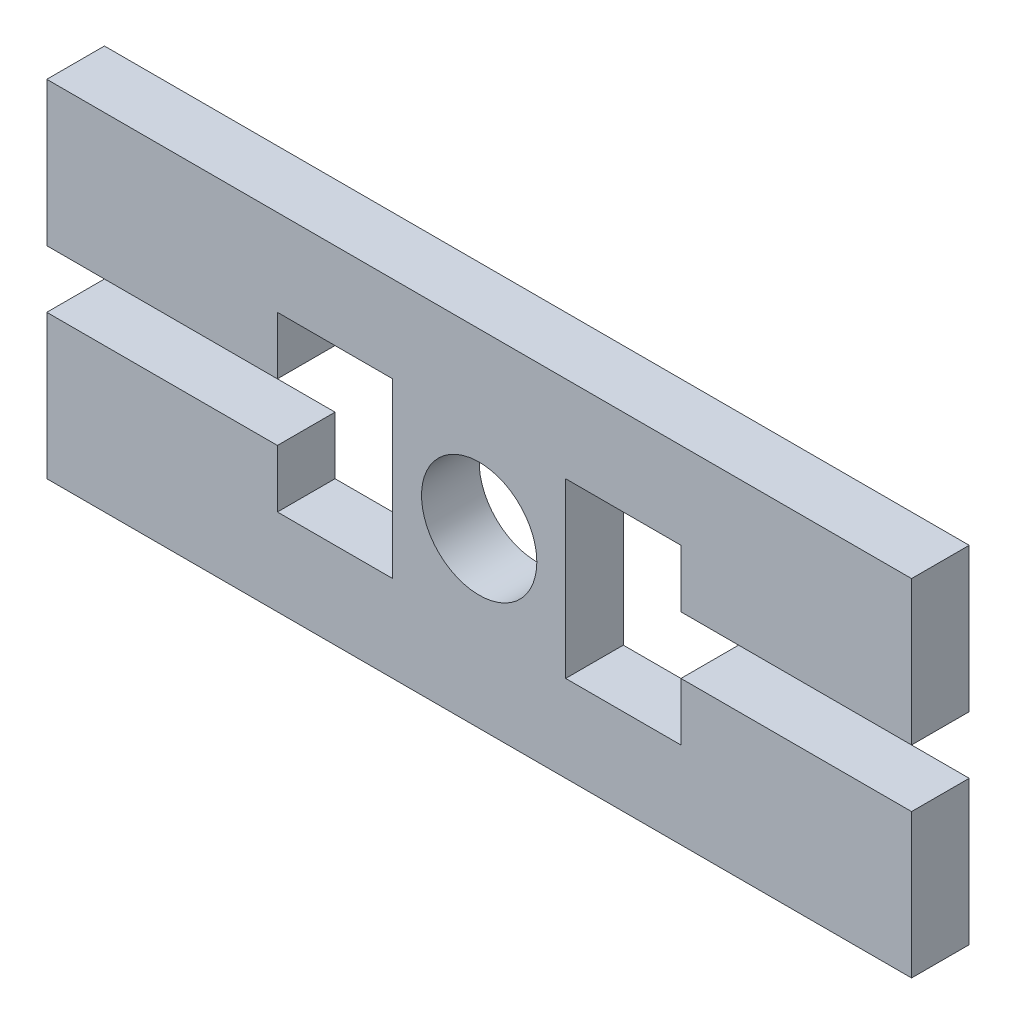
ISO-10303-21;
HEADER;
FILE_DESCRIPTION(('STEP AP214'),'2;1');
FILE_NAME('part.step','',(''),(''),'','','');
FILE_SCHEMA(('AUTOMOTIVE_DESIGN { 1 0 10303 214 1 1 1 1 }'));
ENDSEC;
DATA;
#1=APPLICATION_CONTEXT('core data for automotive mechanical design processes');
#2=APPLICATION_PROTOCOL_DEFINITION('international standard','automotive_design',2000,#1);
#3=PRODUCT_CONTEXT('',#1,'mechanical');
#4=PRODUCT('Part','Part','',(#3));
#5=PRODUCT_RELATED_PRODUCT_CATEGORY('part','',(#4));
#6=PRODUCT_DEFINITION_FORMATION('','',#4);
#7=PRODUCT_DEFINITION_CONTEXT('part definition',#1,'design');
#8=PRODUCT_DEFINITION('design','',#6,#7);
#9=PRODUCT_DEFINITION_SHAPE('','',#8);
#10=(LENGTH_UNIT() NAMED_UNIT(*) SI_UNIT(.MILLI.,.METRE.));
#11=(NAMED_UNIT(*) PLANE_ANGLE_UNIT() SI_UNIT($,.RADIAN.));
#12=(NAMED_UNIT(*) SI_UNIT($,.STERADIAN.) SOLID_ANGLE_UNIT());
#13=UNCERTAINTY_MEASURE_WITH_UNIT(LENGTH_MEASURE(1.E-05),#10,'distance_accuracy_value','');
#14=(GEOMETRIC_REPRESENTATION_CONTEXT(3) GLOBAL_UNCERTAINTY_ASSIGNED_CONTEXT((#13)) GLOBAL_UNIT_ASSIGNED_CONTEXT((#10,
#11,#12)) REPRESENTATION_CONTEXT('',''));
#15=CARTESIAN_POINT('',(0.,0.,0.));
#16=DIRECTION('',(0.,0.,1.));
#17=DIRECTION('',(1.,0.,0.));
#18=AXIS2_PLACEMENT_3D('',#15,#16,#17);
#19=CARTESIAN_POINT('',(0.,0.,12.7));
#20=DIRECTION('',(0.,0.,1.));
#21=DIRECTION('',(1.,0.,0.));
#22=AXIS2_PLACEMENT_3D('',#19,#20,#21);
#23=PLANE('',#22);
#24=DIRECTION('',(0.,1.,0.));
#25=VECTOR('',#24,1.);
#26=CARTESIAN_POINT('',(95.25,-6.35000000000004,12.7));
#27=LINE('',#26,#25);
#28=CARTESIAN_POINT('',(95.25,-38.1,12.7));
#29=VERTEX_POINT('',#28);
#30=CARTESIAN_POINT('',(95.25,-6.35000000000004,12.7));
#31=VERTEX_POINT('',#30);
#32=EDGE_CURVE('E272',#29,#31,#27,.T.);
#33=ORIENTED_EDGE('',*,*,#32,.T.);
#34=DIRECTION('',(-1.,0.,0.));
#35=VECTOR('',#34,1.);
#36=CARTESIAN_POINT('',(95.25,-6.35000000000004,12.7));
#37=LINE('',#36,#35);
#38=CARTESIAN_POINT('',(44.45,-6.35000000000004,12.7));
#39=VERTEX_POINT('',#38);
#40=EDGE_CURVE('E136',#31,#39,#37,.T.);
#41=ORIENTED_EDGE('',*,*,#40,.T.);
#42=DIRECTION('',(0.,-1.,0.));
#43=VECTOR('',#42,1.);
#44=CARTESIAN_POINT('',(44.45,-6.35000000000004,12.7));
#45=LINE('',#44,#43);
#46=CARTESIAN_POINT('',(44.45,-19.05,12.7));
#47=VERTEX_POINT('',#46);
#48=EDGE_CURVE('E341',#39,#47,#45,.T.);
#49=ORIENTED_EDGE('',*,*,#48,.T.);
#50=DIRECTION('',(-1.,0.,0.));
#51=VECTOR('',#50,1.);
#52=CARTESIAN_POINT('',(44.45,-19.05,12.7));
#53=LINE('',#52,#51);
#54=CARTESIAN_POINT('',(19.05,-19.05,12.7));
#55=VERTEX_POINT('',#54);
#56=EDGE_CURVE('E361',#47,#55,#53,.T.);
#57=ORIENTED_EDGE('',*,*,#56,.T.);
#58=DIRECTION('',(0.,1.,0.));
#59=VECTOR('',#58,1.);
#60=CARTESIAN_POINT('',(19.05,19.05,12.7));
#61=LINE('',#60,#59);
#62=CARTESIAN_POINT('',(19.05,19.05,12.7));
#63=VERTEX_POINT('',#62);
#64=EDGE_CURVE('E357',#55,#63,#61,.T.);
#65=ORIENTED_EDGE('',*,*,#64,.T.);
#66=DIRECTION('',(1.,0.,0.));
#67=VECTOR('',#66,1.);
#68=CARTESIAN_POINT('',(44.45,19.05,12.7));
#69=LINE('',#68,#67);
#70=CARTESIAN_POINT('',(44.45,19.05,12.7));
#71=VERTEX_POINT('',#70);
#72=EDGE_CURVE('E360',#63,#71,#69,.T.);
#73=ORIENTED_EDGE('',*,*,#72,.T.);
#74=DIRECTION('',(0.,-1.,0.));
#75=VECTOR('',#74,1.);
#76=CARTESIAN_POINT('',(44.45,6.35000000000002,12.7));
#77=LINE('',#76,#75);
#78=CARTESIAN_POINT('',(44.45,6.35000000000002,12.7));
#79=VERTEX_POINT('',#78);
#80=EDGE_CURVE('E365',#71,#79,#77,.T.);
#81=ORIENTED_EDGE('',*,*,#80,.T.);
#82=DIRECTION('',(1.,0.,0.));
#83=VECTOR('',#82,1.);
#84=CARTESIAN_POINT('',(95.25,6.35000000000002,12.7));
#85=LINE('',#84,#83);
#86=CARTESIAN_POINT('',(95.25,6.35000000000002,12.7));
#87=VERTEX_POINT('',#86);
#88=EDGE_CURVE('E372',#79,#87,#85,.T.);
#89=ORIENTED_EDGE('',*,*,#88,.T.);
#90=DIRECTION('',(0.,1.,0.));
#91=VECTOR('',#90,1.);
#92=CARTESIAN_POINT('',(95.25,38.1,12.7));
#93=LINE('',#92,#91);
#94=CARTESIAN_POINT('',(95.25,38.1,12.7));
#95=VERTEX_POINT('',#94);
#96=EDGE_CURVE('E375',#87,#95,#93,.T.);
#97=ORIENTED_EDGE('',*,*,#96,.T.);
#98=DIRECTION('',(-1.,0.,0.));
#99=VECTOR('',#98,1.);
#100=CARTESIAN_POINT('',(-95.25,38.1,12.7));
#101=LINE('',#100,#99);
#102=CARTESIAN_POINT('',(-95.25,38.1,12.7));
#103=VERTEX_POINT('',#102);
#104=EDGE_CURVE('E378',#95,#103,#101,.T.);
#105=ORIENTED_EDGE('',*,*,#104,.T.);
#106=DIRECTION('',(0.,-1.,0.));
#107=VECTOR('',#106,1.);
#108=CARTESIAN_POINT('',(-95.25,38.1,12.7));
#109=LINE('',#108,#107);
#110=CARTESIAN_POINT('',(-95.25,6.35,12.7));
#111=VERTEX_POINT('',#110);
#112=EDGE_CURVE('E381',#103,#111,#109,.T.);
#113=ORIENTED_EDGE('',*,*,#112,.T.);
#114=DIRECTION('',(1.,0.,0.));
#115=VECTOR('',#114,1.);
#116=CARTESIAN_POINT('',(-95.25,6.35,12.7));
#117=LINE('',#116,#115);
#118=CARTESIAN_POINT('',(-44.45,6.35000000000001,12.7));
#119=VERTEX_POINT('',#118);
#120=EDGE_CURVE('E384',#111,#119,#117,.T.);
#121=ORIENTED_EDGE('',*,*,#120,.T.);
#122=DIRECTION('',(0.,1.,0.));
#123=VECTOR('',#122,1.);
#124=CARTESIAN_POINT('',(-44.45,6.35000000000001,12.7));
#125=LINE('',#124,#123);
#126=CARTESIAN_POINT('',(-44.45,19.05,12.7));
#127=VERTEX_POINT('',#126);
#128=EDGE_CURVE('E387',#119,#127,#125,.T.);
#129=ORIENTED_EDGE('',*,*,#128,.T.);
#130=DIRECTION('',(1.,0.,0.));
#131=VECTOR('',#130,1.);
#132=CARTESIAN_POINT('',(-44.45,19.05,12.7));
#133=LINE('',#132,#131);
#134=CARTESIAN_POINT('',(-19.05,19.05,12.7));
#135=VERTEX_POINT('',#134);
#136=EDGE_CURVE('E390',#127,#135,#133,.T.);
#137=ORIENTED_EDGE('',*,*,#136,.T.);
#138=DIRECTION('',(0.,-1.,0.));
#139=VECTOR('',#138,1.);
#140=CARTESIAN_POINT('',(-19.05,19.05,12.7));
#141=LINE('',#140,#139);
#142=CARTESIAN_POINT('',(-19.05,-19.05,12.7));
#143=VERTEX_POINT('',#142);
#144=EDGE_CURVE('E393',#135,#143,#141,.T.);
#145=ORIENTED_EDGE('',*,*,#144,.T.);
#146=DIRECTION('',(-1.,0.,0.));
#147=VECTOR('',#146,1.);
#148=CARTESIAN_POINT('',(-44.45,-19.05,12.7));
#149=LINE('',#148,#147);
#150=CARTESIAN_POINT('',(-44.45,-19.05,12.7));
#151=VERTEX_POINT('',#150);
#152=EDGE_CURVE('E396',#143,#151,#149,.T.);
#153=ORIENTED_EDGE('',*,*,#152,.T.);
#154=DIRECTION('',(0.,1.,0.));
#155=VECTOR('',#154,1.);
#156=CARTESIAN_POINT('',(-44.45,-6.35000000000001,12.7));
#157=LINE('',#156,#155);
#158=CARTESIAN_POINT('',(-44.45,-6.35000000000001,12.7));
#159=VERTEX_POINT('',#158);
#160=EDGE_CURVE('E191',#151,#159,#157,.T.);
#161=ORIENTED_EDGE('',*,*,#160,.T.);
#162=DIRECTION('',(-1.,0.,0.));
#163=VECTOR('',#162,1.);
#164=CARTESIAN_POINT('',(-95.25,-6.35000000000001,12.7));
#165=LINE('',#164,#163);
#166=CARTESIAN_POINT('',(-95.25,-6.35000000000001,12.7));
#167=VERTEX_POINT('',#166);
#168=EDGE_CURVE('E185',#159,#167,#165,.T.);
#169=ORIENTED_EDGE('',*,*,#168,.T.);
#170=DIRECTION('',(0.,-1.,0.));
#171=VECTOR('',#170,1.);
#172=CARTESIAN_POINT('',(-95.25,-6.35000000000001,12.7));
#173=LINE('',#172,#171);
#174=CARTESIAN_POINT('',(-95.25,-38.1,12.7));
#175=VERTEX_POINT('',#174);
#176=EDGE_CURVE('E189',#167,#175,#173,.T.);
#177=ORIENTED_EDGE('',*,*,#176,.T.);
#178=DIRECTION('',(1.,0.,0.));
#179=VECTOR('',#178,1.);
#180=CARTESIAN_POINT('',(-95.25,-38.1,12.7));
#181=LINE('',#180,#179);
#182=EDGE_CURVE('E57',#175,#29,#181,.T.);
#183=ORIENTED_EDGE('',*,*,#182,.T.);
#184=EDGE_LOOP('',(#33,#41,#49,#57,#65,#73,#81,#89,#97,#105,#113,#121,#129,#137,#145,#153,#161,
#169,#177,#183));
#185=FACE_BOUND('',#184,.T.);
#186=CARTESIAN_POINT('',(0.,0.,12.7));
#187=DIRECTION('',(0.,0.,1.));
#188=DIRECTION('',(1.,0.,0.));
#189=AXIS2_PLACEMENT_3D('',#186,#187,#188);
#190=CIRCLE('',#189,12.7);
#191=CARTESIAN_POINT('',(12.7,0.,12.7));
#192=VERTEX_POINT('',#191);
#193=EDGE_CURVE('E218',#192,#192,#190,.T.);
#194=ORIENTED_EDGE('',*,*,#193,.F.);
#195=EDGE_LOOP('',(#194));
#196=FACE_BOUND('',#195,.T.);
#197=ADVANCED_FACE('F39',(#185,#196),#23,.T.);
#198=CARTESIAN_POINT('',(0.,0.,0.));
#199=DIRECTION('',(0.,0.,1.));
#200=DIRECTION('',(1.,0.,0.));
#201=AXIS2_PLACEMENT_3D('',#198,#199,#200);
#202=PLANE('',#201);
#203=DIRECTION('',(0.,1.,0.));
#204=VECTOR('',#203,1.);
#205=CARTESIAN_POINT('',(95.25,-6.35000000000004,0.));
#206=LINE('',#205,#204);
#207=CARTESIAN_POINT('',(95.25,-38.1,0.));
#208=VERTEX_POINT('',#207);
#209=CARTESIAN_POINT('',(95.25,-6.35000000000004,0.));
#210=VERTEX_POINT('',#209);
#211=EDGE_CURVE('E213',#208,#210,#206,.T.);
#212=ORIENTED_EDGE('',*,*,#211,.F.);
#213=DIRECTION('',(1.,0.,0.));
#214=VECTOR('',#213,1.);
#215=CARTESIAN_POINT('',(-95.25,-38.1,0.));
#216=LINE('',#215,#214);
#217=CARTESIAN_POINT('',(-95.25,-38.1,0.));
#218=VERTEX_POINT('',#217);
#219=EDGE_CURVE('E128',#218,#208,#216,.T.);
#220=ORIENTED_EDGE('',*,*,#219,.F.);
#221=DIRECTION('',(0.,-1.,0.));
#222=VECTOR('',#221,1.);
#223=CARTESIAN_POINT('',(-95.25,-6.35000000000001,0.));
#224=LINE('',#223,#222);
#225=CARTESIAN_POINT('',(-95.25,-6.35000000000001,0.));
#226=VERTEX_POINT('',#225);
#227=EDGE_CURVE('E122',#226,#218,#224,.T.);
#228=ORIENTED_EDGE('',*,*,#227,.F.);
#229=DIRECTION('',(-1.,0.,0.));
#230=VECTOR('',#229,1.);
#231=CARTESIAN_POINT('',(-95.25,-6.35000000000001,0.));
#232=LINE('',#231,#230);
#233=CARTESIAN_POINT('',(-44.45,-6.35000000000001,0.));
#234=VERTEX_POINT('',#233);
#235=EDGE_CURVE('E200',#234,#226,#232,.T.);
#236=ORIENTED_EDGE('',*,*,#235,.F.);
#237=DIRECTION('',(0.,1.,0.));
#238=VECTOR('',#237,1.);
#239=CARTESIAN_POINT('',(-44.45,-6.35000000000001,0.));
#240=LINE('',#239,#238);
#241=CARTESIAN_POINT('',(-44.45,-19.05,0.));
#242=VERTEX_POINT('',#241);
#243=EDGE_CURVE('E263',#242,#234,#240,.T.);
#244=ORIENTED_EDGE('',*,*,#243,.F.);
#245=DIRECTION('',(-1.,0.,0.));
#246=VECTOR('',#245,1.);
#247=CARTESIAN_POINT('',(-44.45,-19.05,0.));
#248=LINE('',#247,#246);
#249=CARTESIAN_POINT('',(-19.05,-19.05,0.));
#250=VERTEX_POINT('',#249);
#251=EDGE_CURVE('E260',#250,#242,#248,.T.);
#252=ORIENTED_EDGE('',*,*,#251,.F.);
#253=DIRECTION('',(0.,-1.,0.));
#254=VECTOR('',#253,1.);
#255=CARTESIAN_POINT('',(-19.05,19.05,0.));
#256=LINE('',#255,#254);
#257=CARTESIAN_POINT('',(-19.05,19.05,0.));
#258=VERTEX_POINT('',#257);
#259=EDGE_CURVE('E257',#258,#250,#256,.T.);
#260=ORIENTED_EDGE('',*,*,#259,.F.);
#261=DIRECTION('',(1.,0.,0.));
#262=VECTOR('',#261,1.);
#263=CARTESIAN_POINT('',(-44.45,19.05,0.));
#264=LINE('',#263,#262);
#265=CARTESIAN_POINT('',(-44.45,19.05,0.));
#266=VERTEX_POINT('',#265);
#267=EDGE_CURVE('E254',#266,#258,#264,.T.);
#268=ORIENTED_EDGE('',*,*,#267,.F.);
#269=DIRECTION('',(0.,1.,0.));
#270=VECTOR('',#269,1.);
#271=CARTESIAN_POINT('',(-44.45,6.35000000000001,0.));
#272=LINE('',#271,#270);
#273=CARTESIAN_POINT('',(-44.45,6.35000000000001,0.));
#274=VERTEX_POINT('',#273);
#275=EDGE_CURVE('E251',#274,#266,#272,.T.);
#276=ORIENTED_EDGE('',*,*,#275,.F.);
#277=DIRECTION('',(1.,0.,0.));
#278=VECTOR('',#277,1.);
#279=CARTESIAN_POINT('',(-95.25,6.35,0.));
#280=LINE('',#279,#278);
#281=CARTESIAN_POINT('',(-95.25,6.35,0.));
#282=VERTEX_POINT('',#281);
#283=EDGE_CURVE('E248',#282,#274,#280,.T.);
#284=ORIENTED_EDGE('',*,*,#283,.F.);
#285=DIRECTION('',(0.,-1.,0.));
#286=VECTOR('',#285,1.);
#287=CARTESIAN_POINT('',(-95.25,38.1,0.));
#288=LINE('',#287,#286);
#289=CARTESIAN_POINT('',(-95.25,38.1,0.));
#290=VERTEX_POINT('',#289);
#291=EDGE_CURVE('E245',#290,#282,#288,.T.);
#292=ORIENTED_EDGE('',*,*,#291,.F.);
#293=DIRECTION('',(-1.,0.,0.));
#294=VECTOR('',#293,1.);
#295=CARTESIAN_POINT('',(-95.25,38.1,0.));
#296=LINE('',#295,#294);
#297=CARTESIAN_POINT('',(95.25,38.1,0.));
#298=VERTEX_POINT('',#297);
#299=EDGE_CURVE('E242',#298,#290,#296,.T.);
#300=ORIENTED_EDGE('',*,*,#299,.F.);
#301=DIRECTION('',(0.,1.,0.));
#302=VECTOR('',#301,1.);
#303=CARTESIAN_POINT('',(95.25,38.1,0.));
#304=LINE('',#303,#302);
#305=CARTESIAN_POINT('',(95.25,6.35000000000002,0.));
#306=VERTEX_POINT('',#305);
#307=EDGE_CURVE('E239',#306,#298,#304,.T.);
#308=ORIENTED_EDGE('',*,*,#307,.F.);
#309=DIRECTION('',(1.,0.,0.));
#310=VECTOR('',#309,1.);
#311=CARTESIAN_POINT('',(95.25,6.35000000000002,0.));
#312=LINE('',#311,#310);
#313=CARTESIAN_POINT('',(44.45,6.35000000000002,0.));
#314=VERTEX_POINT('',#313);
#315=EDGE_CURVE('E236',#314,#306,#312,.T.);
#316=ORIENTED_EDGE('',*,*,#315,.F.);
#317=DIRECTION('',(0.,-1.,0.));
#318=VECTOR('',#317,1.);
#319=CARTESIAN_POINT('',(44.45,6.35000000000002,0.));
#320=LINE('',#319,#318);
#321=CARTESIAN_POINT('',(44.45,19.05,0.));
#322=VERTEX_POINT('',#321);
#323=EDGE_CURVE('E233',#322,#314,#320,.T.);
#324=ORIENTED_EDGE('',*,*,#323,.F.);
#325=DIRECTION('',(1.,0.,0.));
#326=VECTOR('',#325,1.);
#327=CARTESIAN_POINT('',(44.45,19.05,0.));
#328=LINE('',#327,#326);
#329=CARTESIAN_POINT('',(19.05,19.05,0.));
#330=VERTEX_POINT('',#329);
#331=EDGE_CURVE('E230',#330,#322,#328,.T.);
#332=ORIENTED_EDGE('',*,*,#331,.F.);
#333=DIRECTION('',(0.,1.,0.));
#334=VECTOR('',#333,1.);
#335=CARTESIAN_POINT('',(19.05,19.05,0.));
#336=LINE('',#335,#334);
#337=CARTESIAN_POINT('',(19.05,-19.05,0.));
#338=VERTEX_POINT('',#337);
#339=EDGE_CURVE('E227',#338,#330,#336,.T.);
#340=ORIENTED_EDGE('',*,*,#339,.F.);
#341=DIRECTION('',(-1.,0.,0.));
#342=VECTOR('',#341,1.);
#343=CARTESIAN_POINT('',(44.45,-19.05,0.));
#344=LINE('',#343,#342);
#345=CARTESIAN_POINT('',(44.45,-19.05,0.));
#346=VERTEX_POINT('',#345);
#347=EDGE_CURVE('E224',#346,#338,#344,.T.);
#348=ORIENTED_EDGE('',*,*,#347,.F.);
#349=DIRECTION('',(0.,-1.,0.));
#350=VECTOR('',#349,1.);
#351=CARTESIAN_POINT('',(44.45,-6.35000000000004,0.));
#352=LINE('',#351,#350);
#353=CARTESIAN_POINT('',(44.45,-6.35000000000004,0.));
#354=VERTEX_POINT('',#353);
#355=EDGE_CURVE('E221',#354,#346,#352,.T.);
#356=ORIENTED_EDGE('',*,*,#355,.F.);
#357=DIRECTION('',(-1.,0.,0.));
#358=VECTOR('',#357,1.);
#359=CARTESIAN_POINT('',(95.25,-6.35000000000004,0.));
#360=LINE('',#359,#358);
#361=EDGE_CURVE('E217',#210,#354,#360,.T.);
#362=ORIENTED_EDGE('',*,*,#361,.F.);
#363=EDGE_LOOP('',(#212,#220,#228,#236,#244,#252,#260,#268,#276,#284,#292,#300,#308,#316,#324,
#332,#340,#348,#356,#362));
#364=FACE_BOUND('',#363,.T.);
#365=CARTESIAN_POINT('',(0.,0.,0.));
#366=DIRECTION('',(0.,0.,1.));
#367=DIRECTION('',(1.,0.,0.));
#368=AXIS2_PLACEMENT_3D('',#365,#366,#367);
#369=CIRCLE('',#368,12.7);
#370=CARTESIAN_POINT('',(12.7,0.,0.));
#371=VERTEX_POINT('',#370);
#372=EDGE_CURVE('E649',#371,#371,#369,.T.);
#373=ORIENTED_EDGE('',*,*,#372,.T.);
#374=EDGE_LOOP('',(#373));
#375=FACE_BOUND('',#374,.T.);
#376=ADVANCED_FACE('F345',(#364,#375),#202,.F.);
#377=CARTESIAN_POINT('',(95.25,-6.35000000000004,12.7));
#378=DIRECTION('',(-1.,0.,0.));
#379=DIRECTION('',(0.,0.,1.));
#380=AXIS2_PLACEMENT_3D('',#377,#378,#379);
#381=PLANE('',#380);
#382=ORIENTED_EDGE('',*,*,#211,.T.);
#383=DIRECTION('',(0.,0.,-1.));
#384=VECTOR('',#383,1.);
#385=CARTESIAN_POINT('',(95.25,-6.35000000000004,12.7));
#386=LINE('',#385,#384);
#387=EDGE_CURVE('E11',#31,#210,#386,.T.);
#388=ORIENTED_EDGE('',*,*,#387,.F.);
#389=ORIENTED_EDGE('',*,*,#32,.F.);
#390=DIRECTION('',(0.,0.,-1.));
#391=VECTOR('',#390,1.);
#392=CARTESIAN_POINT('',(95.25,-38.1,12.7));
#393=LINE('',#392,#391);
#394=EDGE_CURVE('E209',#29,#208,#393,.T.);
#395=ORIENTED_EDGE('',*,*,#394,.T.);
#396=EDGE_LOOP('',(#382,#388,#389,#395));
#397=FACE_BOUND('',#396,.T.);
#398=ADVANCED_FACE('F41',(#397),#381,.F.);
#399=CARTESIAN_POINT('',(95.25,-6.35000000000004,12.7));
#400=DIRECTION('',(0.,-1.,0.));
#401=DIRECTION('',(0.,0.,-1.));
#402=AXIS2_PLACEMENT_3D('',#399,#400,#401);
#403=PLANE('',#402);
#404=ORIENTED_EDGE('',*,*,#361,.T.);
#405=DIRECTION('',(0.,0.,-1.));
#406=VECTOR('',#405,1.);
#407=CARTESIAN_POINT('',(44.45,-6.35000000000004,12.7));
#408=LINE('',#407,#406);
#409=EDGE_CURVE('E49',#39,#354,#408,.T.);
#410=ORIENTED_EDGE('',*,*,#409,.F.);
#411=ORIENTED_EDGE('',*,*,#40,.F.);
#412=ORIENTED_EDGE('',*,*,#387,.T.);
#413=EDGE_LOOP('',(#404,#410,#411,#412));
#414=FACE_BOUND('',#413,.T.);
#415=ADVANCED_FACE('F432',(#414),#403,.F.);
#416=CARTESIAN_POINT('',(44.45,-6.35000000000004,12.7));
#417=DIRECTION('',(1.,0.,0.));
#418=DIRECTION('',(0.,0.,-1.));
#419=AXIS2_PLACEMENT_3D('',#416,#417,#418);
#420=PLANE('',#419);
#421=ORIENTED_EDGE('',*,*,#355,.T.);
#422=DIRECTION('',(0.,0.,-1.));
#423=VECTOR('',#422,1.);
#424=CARTESIAN_POINT('',(44.45,-19.05,12.7));
#425=LINE('',#424,#423);
#426=EDGE_CURVE('E331',#47,#346,#425,.T.);
#427=ORIENTED_EDGE('',*,*,#426,.F.);
#428=ORIENTED_EDGE('',*,*,#48,.F.);
#429=ORIENTED_EDGE('',*,*,#409,.T.);
#430=EDGE_LOOP('',(#421,#427,#428,#429));
#431=FACE_BOUND('',#430,.T.);
#432=ADVANCED_FACE('F339',(#431),#420,.F.);
#433=CARTESIAN_POINT('',(44.45,-19.05,12.7));
#434=DIRECTION('',(0.,-1.,0.));
#435=DIRECTION('',(0.,0.,-1.));
#436=AXIS2_PLACEMENT_3D('',#433,#434,#435);
#437=PLANE('',#436);
#438=ORIENTED_EDGE('',*,*,#347,.T.);
#439=DIRECTION('',(0.,0.,-1.));
#440=VECTOR('',#439,1.);
#441=CARTESIAN_POINT('',(19.05,-19.05,12.7));
#442=LINE('',#441,#440);
#443=EDGE_CURVE('E327',#55,#338,#442,.T.);
#444=ORIENTED_EDGE('',*,*,#443,.F.);
#445=ORIENTED_EDGE('',*,*,#56,.F.);
#446=ORIENTED_EDGE('',*,*,#426,.T.);
#447=EDGE_LOOP('',(#438,#444,#445,#446));
#448=FACE_BOUND('',#447,.T.);
#449=ADVANCED_FACE('F351',(#448),#437,.F.);
#450=CARTESIAN_POINT('',(19.05,19.05,12.7));
#451=DIRECTION('',(-1.,0.,0.));
#452=DIRECTION('',(0.,-1.,0.));
#453=AXIS2_PLACEMENT_3D('',#450,#451,#452);
#454=PLANE('',#453);
#455=ORIENTED_EDGE('',*,*,#339,.T.);
#456=DIRECTION('',(0.,0.,-1.));
#457=VECTOR('',#456,1.);
#458=CARTESIAN_POINT('',(19.05,19.05,12.7));
#459=LINE('',#458,#457);
#460=EDGE_CURVE('E323',#63,#330,#459,.T.);
#461=ORIENTED_EDGE('',*,*,#460,.F.);
#462=ORIENTED_EDGE('',*,*,#64,.F.);
#463=ORIENTED_EDGE('',*,*,#443,.T.);
#464=EDGE_LOOP('',(#455,#461,#462,#463));
#465=FACE_BOUND('',#464,.T.);
#466=ADVANCED_FACE('F355',(#465),#454,.F.);
#467=CARTESIAN_POINT('',(44.45,19.05,12.7));
#468=DIRECTION('',(0.,1.,0.));
#469=DIRECTION('',(-1.,0.,0.));
#470=AXIS2_PLACEMENT_3D('',#467,#468,#469);
#471=PLANE('',#470);
#472=ORIENTED_EDGE('',*,*,#331,.T.);
#473=DIRECTION('',(0.,0.,-1.));
#474=VECTOR('',#473,1.);
#475=CARTESIAN_POINT('',(44.45,19.05,12.7));
#476=LINE('',#475,#474);
#477=EDGE_CURVE('E319',#71,#322,#476,.T.);
#478=ORIENTED_EDGE('',*,*,#477,.F.);
#479=ORIENTED_EDGE('',*,*,#72,.F.);
#480=ORIENTED_EDGE('',*,*,#460,.T.);
#481=EDGE_LOOP('',(#472,#478,#479,#480));
#482=FACE_BOUND('',#481,.T.);
#483=ADVANCED_FACE('F445',(#482),#471,.F.);
#484=CARTESIAN_POINT('',(44.45,6.35000000000002,12.7));
#485=DIRECTION('',(1.,0.,0.));
#486=DIRECTION('',(0.,1.,0.));
#487=AXIS2_PLACEMENT_3D('',#484,#485,#486);
#488=PLANE('',#487);
#489=ORIENTED_EDGE('',*,*,#323,.T.);
#490=DIRECTION('',(0.,0.,-1.));
#491=VECTOR('',#490,1.);
#492=CARTESIAN_POINT('',(44.45,6.35000000000002,12.7));
#493=LINE('',#492,#491);
#494=EDGE_CURVE('E315',#79,#314,#493,.T.);
#495=ORIENTED_EDGE('',*,*,#494,.F.);
#496=ORIENTED_EDGE('',*,*,#80,.F.);
#497=ORIENTED_EDGE('',*,*,#477,.T.);
#498=EDGE_LOOP('',(#489,#495,#496,#497));
#499=FACE_BOUND('',#498,.T.);
#500=ADVANCED_FACE('F448',(#499),#488,.F.);
#501=CARTESIAN_POINT('',(95.25,6.35000000000002,12.7));
#502=DIRECTION('',(0.,1.,0.));
#503=DIRECTION('',(-1.,0.,0.));
#504=AXIS2_PLACEMENT_3D('',#501,#502,#503);
#505=PLANE('',#504);
#506=ORIENTED_EDGE('',*,*,#315,.T.);
#507=DIRECTION('',(0.,0.,-1.));
#508=VECTOR('',#507,1.);
#509=CARTESIAN_POINT('',(95.25,6.35000000000002,12.7));
#510=LINE('',#509,#508);
#511=EDGE_CURVE('E311',#87,#306,#510,.T.);
#512=ORIENTED_EDGE('',*,*,#511,.F.);
#513=ORIENTED_EDGE('',*,*,#88,.F.);
#514=ORIENTED_EDGE('',*,*,#494,.T.);
#515=EDGE_LOOP('',(#506,#512,#513,#514));
#516=FACE_BOUND('',#515,.T.);
#517=ADVANCED_FACE('F452',(#516),#505,.F.);
#518=CARTESIAN_POINT('',(95.25,38.1,12.7));
#519=DIRECTION('',(-1.,0.,0.));
#520=DIRECTION('',(0.,0.,1.));
#521=AXIS2_PLACEMENT_3D('',#518,#519,#520);
#522=PLANE('',#521);
#523=ORIENTED_EDGE('',*,*,#307,.T.);
#524=DIRECTION('',(0.,0.,-1.));
#525=VECTOR('',#524,1.);
#526=CARTESIAN_POINT('',(95.25,38.1,12.7));
#527=LINE('',#526,#525);
#528=EDGE_CURVE('E307',#95,#298,#527,.T.);
#529=ORIENTED_EDGE('',*,*,#528,.F.);
#530=ORIENTED_EDGE('',*,*,#96,.F.);
#531=ORIENTED_EDGE('',*,*,#511,.T.);
#532=EDGE_LOOP('',(#523,#529,#530,#531));
#533=FACE_BOUND('',#532,.T.);
#534=ADVANCED_FACE('F456',(#533),#522,.F.);
#535=CARTESIAN_POINT('',(-95.25,38.1,12.7));
#536=DIRECTION('',(0.,-1.,0.));
#537=DIRECTION('',(0.,0.,-1.));
#538=AXIS2_PLACEMENT_3D('',#535,#536,#537);
#539=PLANE('',#538);
#540=ORIENTED_EDGE('',*,*,#299,.T.);
#541=DIRECTION('',(0.,0.,-1.));
#542=VECTOR('',#541,1.);
#543=CARTESIAN_POINT('',(-95.25,38.1,12.7));
#544=LINE('',#543,#542);
#545=EDGE_CURVE('E303',#103,#290,#544,.T.);
#546=ORIENTED_EDGE('',*,*,#545,.F.);
#547=ORIENTED_EDGE('',*,*,#104,.F.);
#548=ORIENTED_EDGE('',*,*,#528,.T.);
#549=EDGE_LOOP('',(#540,#546,#547,#548));
#550=FACE_BOUND('',#549,.T.);
#551=ADVANCED_FACE('F460',(#550),#539,.F.);
#552=CARTESIAN_POINT('',(-95.25,38.1,12.7));
#553=DIRECTION('',(1.,0.,0.));
#554=DIRECTION('',(0.,1.,0.));
#555=AXIS2_PLACEMENT_3D('',#552,#553,#554);
#556=PLANE('',#555);
#557=ORIENTED_EDGE('',*,*,#291,.T.);
#558=DIRECTION('',(0.,0.,-1.));
#559=VECTOR('',#558,1.);
#560=CARTESIAN_POINT('',(-95.25,6.35,12.7));
#561=LINE('',#560,#559);
#562=EDGE_CURVE('E299',#111,#282,#561,.T.);
#563=ORIENTED_EDGE('',*,*,#562,.F.);
#564=ORIENTED_EDGE('',*,*,#112,.F.);
#565=ORIENTED_EDGE('',*,*,#545,.T.);
#566=EDGE_LOOP('',(#557,#563,#564,#565));
#567=FACE_BOUND('',#566,.T.);
#568=ADVANCED_FACE('F464',(#567),#556,.F.);
#569=CARTESIAN_POINT('',(-95.25,6.35,12.7));
#570=DIRECTION('',(0.,1.,0.));
#571=DIRECTION('',(-1.,0.,0.));
#572=AXIS2_PLACEMENT_3D('',#569,#570,#571);
#573=PLANE('',#572);
#574=ORIENTED_EDGE('',*,*,#283,.T.);
#575=DIRECTION('',(0.,0.,-1.));
#576=VECTOR('',#575,1.);
#577=CARTESIAN_POINT('',(-44.45,6.35000000000001,12.7));
#578=LINE('',#577,#576);
#579=EDGE_CURVE('E295',#119,#274,#578,.T.);
#580=ORIENTED_EDGE('',*,*,#579,.F.);
#581=ORIENTED_EDGE('',*,*,#120,.F.);
#582=ORIENTED_EDGE('',*,*,#562,.T.);
#583=EDGE_LOOP('',(#574,#580,#581,#582));
#584=FACE_BOUND('',#583,.T.);
#585=ADVANCED_FACE('F468',(#584),#573,.F.);
#586=CARTESIAN_POINT('',(-44.45,6.35000000000001,12.7));
#587=DIRECTION('',(-1.,0.,0.));
#588=DIRECTION('',(0.,0.,1.));
#589=AXIS2_PLACEMENT_3D('',#586,#587,#588);
#590=PLANE('',#589);
#591=ORIENTED_EDGE('',*,*,#275,.T.);
#592=DIRECTION('',(0.,0.,-1.));
#593=VECTOR('',#592,1.);
#594=CARTESIAN_POINT('',(-44.45,19.05,12.7));
#595=LINE('',#594,#593);
#596=EDGE_CURVE('E291',#127,#266,#595,.T.);
#597=ORIENTED_EDGE('',*,*,#596,.F.);
#598=ORIENTED_EDGE('',*,*,#128,.F.);
#599=ORIENTED_EDGE('',*,*,#579,.T.);
#600=EDGE_LOOP('',(#591,#597,#598,#599));
#601=FACE_BOUND('',#600,.T.);
#602=ADVANCED_FACE('F472',(#601),#590,.F.);
#603=CARTESIAN_POINT('',(-44.45,19.05,12.7));
#604=DIRECTION('',(0.,1.,0.));
#605=DIRECTION('',(-1.,0.,0.));
#606=AXIS2_PLACEMENT_3D('',#603,#604,#605);
#607=PLANE('',#606);
#608=ORIENTED_EDGE('',*,*,#267,.T.);
#609=DIRECTION('',(0.,0.,-1.));
#610=VECTOR('',#609,1.);
#611=CARTESIAN_POINT('',(-19.05,19.05,12.7));
#612=LINE('',#611,#610);
#613=EDGE_CURVE('E287',#135,#258,#612,.T.);
#614=ORIENTED_EDGE('',*,*,#613,.F.);
#615=ORIENTED_EDGE('',*,*,#136,.F.);
#616=ORIENTED_EDGE('',*,*,#596,.T.);
#617=EDGE_LOOP('',(#608,#614,#615,#616));
#618=FACE_BOUND('',#617,.T.);
#619=ADVANCED_FACE('F476',(#618),#607,.F.);
#620=CARTESIAN_POINT('',(-19.05,19.05,12.7));
#621=DIRECTION('',(1.,0.,0.));
#622=DIRECTION('',(0.,1.,0.));
#623=AXIS2_PLACEMENT_3D('',#620,#621,#622);
#624=PLANE('',#623);
#625=ORIENTED_EDGE('',*,*,#259,.T.);
#626=DIRECTION('',(0.,0.,-1.));
#627=VECTOR('',#626,1.);
#628=CARTESIAN_POINT('',(-19.05,-19.05,12.7));
#629=LINE('',#628,#627);
#630=EDGE_CURVE('E283',#143,#250,#629,.T.);
#631=ORIENTED_EDGE('',*,*,#630,.F.);
#632=ORIENTED_EDGE('',*,*,#144,.F.);
#633=ORIENTED_EDGE('',*,*,#613,.T.);
#634=EDGE_LOOP('',(#625,#631,#632,#633));
#635=FACE_BOUND('',#634,.T.);
#636=ADVANCED_FACE('F480',(#635),#624,.F.);
#637=CARTESIAN_POINT('',(-44.45,-19.05,12.7));
#638=DIRECTION('',(0.,-1.,0.));
#639=DIRECTION('',(0.,0.,-1.));
#640=AXIS2_PLACEMENT_3D('',#637,#638,#639);
#641=PLANE('',#640);
#642=ORIENTED_EDGE('',*,*,#251,.T.);
#643=DIRECTION('',(0.,0.,-1.));
#644=VECTOR('',#643,1.);
#645=CARTESIAN_POINT('',(-44.45,-19.05,12.7));
#646=LINE('',#645,#644);
#647=EDGE_CURVE('E279',#151,#242,#646,.T.);
#648=ORIENTED_EDGE('',*,*,#647,.F.);
#649=ORIENTED_EDGE('',*,*,#152,.F.);
#650=ORIENTED_EDGE('',*,*,#630,.T.);
#651=EDGE_LOOP('',(#642,#648,#649,#650));
#652=FACE_BOUND('',#651,.T.);
#653=ADVANCED_FACE('F404',(#652),#641,.F.);
#654=CARTESIAN_POINT('',(-44.45,-6.35000000000001,12.7));
#655=DIRECTION('',(-1.,0.,0.));
#656=DIRECTION('',(0.,-1.,0.));
#657=AXIS2_PLACEMENT_3D('',#654,#655,#656);
#658=PLANE('',#657);
#659=ORIENTED_EDGE('',*,*,#243,.T.);
#660=DIRECTION('',(0.,0.,-1.));
#661=VECTOR('',#660,1.);
#662=CARTESIAN_POINT('',(-44.45,-6.35000000000001,12.7));
#663=LINE('',#662,#661);
#664=EDGE_CURVE('E202',#159,#234,#663,.T.);
#665=ORIENTED_EDGE('',*,*,#664,.F.);
#666=ORIENTED_EDGE('',*,*,#160,.F.);
#667=ORIENTED_EDGE('',*,*,#647,.T.);
#668=EDGE_LOOP('',(#659,#665,#666,#667));
#669=FACE_BOUND('',#668,.T.);
#670=ADVANCED_FACE('F408',(#669),#658,.F.);
#671=CARTESIAN_POINT('',(-95.25,-6.35000000000001,12.7));
#672=DIRECTION('',(0.,-1.,0.));
#673=DIRECTION('',(0.,0.,-1.));
#674=AXIS2_PLACEMENT_3D('',#671,#672,#673);
#675=PLANE('',#674);
#676=ORIENTED_EDGE('',*,*,#235,.T.);
#677=DIRECTION('',(0.,0.,-1.));
#678=VECTOR('',#677,1.);
#679=CARTESIAN_POINT('',(-95.25,-6.35000000000001,12.7));
#680=LINE('',#679,#678);
#681=EDGE_CURVE('E197',#167,#226,#680,.T.);
#682=ORIENTED_EDGE('',*,*,#681,.F.);
#683=ORIENTED_EDGE('',*,*,#168,.F.);
#684=ORIENTED_EDGE('',*,*,#664,.T.);
#685=EDGE_LOOP('',(#676,#682,#683,#684));
#686=FACE_BOUND('',#685,.T.);
#687=ADVANCED_FACE('F198',(#686),#675,.F.);
#688=CARTESIAN_POINT('',(-95.25,-6.35000000000001,12.7));
#689=DIRECTION('',(1.,0.,0.));
#690=DIRECTION('',(0.,1.,0.));
#691=AXIS2_PLACEMENT_3D('',#688,#689,#690);
#692=PLANE('',#691);
#693=ORIENTED_EDGE('',*,*,#227,.T.);
#694=DIRECTION('',(0.,0.,-1.));
#695=VECTOR('',#694,1.);
#696=CARTESIAN_POINT('',(-95.25,-38.1,12.7));
#697=LINE('',#696,#695);
#698=EDGE_CURVE('E203',#175,#218,#697,.T.);
#699=ORIENTED_EDGE('',*,*,#698,.F.);
#700=ORIENTED_EDGE('',*,*,#176,.F.);
#701=ORIENTED_EDGE('',*,*,#681,.T.);
#702=EDGE_LOOP('',(#693,#699,#700,#701));
#703=FACE_BOUND('',#702,.T.);
#704=ADVANCED_FACE('F205',(#703),#692,.F.);
#705=CARTESIAN_POINT('',(-95.25,-38.1,12.7));
#706=DIRECTION('',(0.,1.,0.));
#707=DIRECTION('',(0.,0.,1.));
#708=AXIS2_PLACEMENT_3D('',#705,#706,#707);
#709=PLANE('',#708);
#710=ORIENTED_EDGE('',*,*,#219,.T.);
#711=ORIENTED_EDGE('',*,*,#394,.F.);
#712=ORIENTED_EDGE('',*,*,#182,.F.);
#713=ORIENTED_EDGE('',*,*,#698,.T.);
#714=EDGE_LOOP('',(#710,#711,#712,#713));
#715=FACE_BOUND('',#714,.T.);
#716=ADVANCED_FACE('F412',(#715),#709,.F.);
#717=CARTESIAN_POINT('',(0.,0.,12.7));
#718=DIRECTION('',(0.,0.,-1.));
#719=DIRECTION('',(-1.,0.,0.));
#720=AXIS2_PLACEMENT_3D('',#717,#718,#719);
#721=CYLINDRICAL_SURFACE('',#720,12.7);
#722=ORIENTED_EDGE('',*,*,#193,.T.);
#723=EDGE_LOOP('',(#722));
#724=FACE_BOUND('',#723,.T.);
#725=ORIENTED_EDGE('',*,*,#372,.F.);
#726=EDGE_LOOP('',(#725));
#727=FACE_BOUND('',#726,.T.);
#728=ADVANCED_FACE('F414',(#724,#727),#721,.F.);
#729=CLOSED_SHELL('',(#197,#376,#398,#415,#432,#449,#466,#483,#500,#517,#534,#551,#568,#585,
#602,#619,#636,#653,#670,#687,#704,#716,#728));
#730=MANIFOLD_SOLID_BREP('B2',#729);
#731=ADVANCED_BREP_SHAPE_REPRESENTATION('',(#18,#730),#14);
#732=SHAPE_DEFINITION_REPRESENTATION(#9,#731);
ENDSEC;
END-ISO-10303-21;
